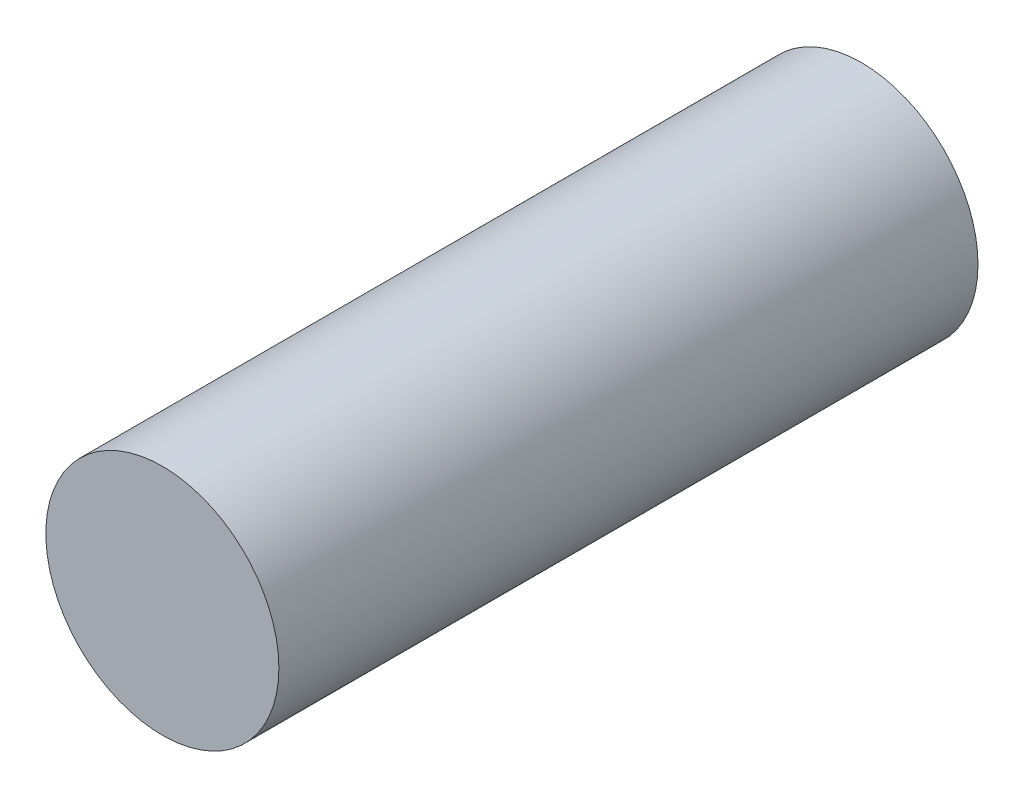
ISO-10303-21;
HEADER;
FILE_DESCRIPTION(('STEP AP214'),'2;1');
FILE_NAME('part.step','',(''),(''),'','','');
FILE_SCHEMA(('AUTOMOTIVE_DESIGN { 1 0 10303 214 1 1 1 1 }'));
ENDSEC;
DATA;
#1=APPLICATION_CONTEXT('core data for automotive mechanical design processes');
#2=APPLICATION_PROTOCOL_DEFINITION('international standard','automotive_design',2000,#1);
#3=PRODUCT_CONTEXT('',#1,'mechanical');
#4=PRODUCT('Part','Part','',(#3));
#5=PRODUCT_RELATED_PRODUCT_CATEGORY('part','',(#4));
#6=PRODUCT_DEFINITION_FORMATION('','',#4);
#7=PRODUCT_DEFINITION_CONTEXT('part definition',#1,'design');
#8=PRODUCT_DEFINITION('design','',#6,#7);
#9=PRODUCT_DEFINITION_SHAPE('','',#8);
#10=(LENGTH_UNIT() NAMED_UNIT(*) SI_UNIT(.MILLI.,.METRE.));
#11=(NAMED_UNIT(*) PLANE_ANGLE_UNIT() SI_UNIT($,.RADIAN.));
#12=(NAMED_UNIT(*) SI_UNIT($,.STERADIAN.) SOLID_ANGLE_UNIT());
#13=UNCERTAINTY_MEASURE_WITH_UNIT(LENGTH_MEASURE(1.E-05),#10,'distance_accuracy_value','');
#14=(GEOMETRIC_REPRESENTATION_CONTEXT(3) GLOBAL_UNCERTAINTY_ASSIGNED_CONTEXT((#13)) GLOBAL_UNIT_ASSIGNED_CONTEXT((#10,
#11,#12)) REPRESENTATION_CONTEXT('',''));
#15=CARTESIAN_POINT('',(0.,0.,0.));
#16=DIRECTION('',(0.,0.,1.));
#17=DIRECTION('',(1.,0.,0.));
#18=AXIS2_PLACEMENT_3D('',#15,#16,#17);
#19=CARTESIAN_POINT('',(-120.238104213596,50.1850711924744,-90.0000000000001));
#20=DIRECTION('',(0.,0.,-1.));
#21=DIRECTION('',(0.,-1.,0.));
#22=AXIS2_PLACEMENT_3D('',#19,#20,#21);
#23=PLANE('',#22);
#24=CARTESIAN_POINT('',(-120.238104213596,50.1850711924743,-90.0000000000001));
#25=DIRECTION('',(0.,0.,-1.));
#26=DIRECTION('',(0.,1.,0.));
#27=AXIS2_PLACEMENT_3D('',#24,#25,#26);
#28=CIRCLE('',#27,15.);
#29=CARTESIAN_POINT('',(-120.238104213596,65.1850711924743,-90.0000000000001));
#30=VERTEX_POINT('',#29);
#31=EDGE_CURVE('E10',#30,#30,#28,.F.);
#32=ORIENTED_EDGE('',*,*,#31,.F.);
#33=EDGE_LOOP('',(#32));
#34=FACE_BOUND('',#33,.T.);
#35=ADVANCED_FACE('F37',(#34),#23,.T.);
#36=CARTESIAN_POINT('',(-120.238104213596,50.1850711924743,0.));
#37=DIRECTION('',(0.,0.,1.));
#38=DIRECTION('',(1.,0.,0.));
#39=AXIS2_PLACEMENT_3D('',#36,#37,#38);
#40=PLANE('',#39);
#41=CARTESIAN_POINT('',(-120.238104213596,50.1850711924743,0.));
#42=DIRECTION('',(0.,0.,1.));
#43=DIRECTION('',(1.,0.,0.));
#44=AXIS2_PLACEMENT_3D('',#41,#42,#43);
#45=CIRCLE('',#44,15.);
#46=CARTESIAN_POINT('',(-105.238104213596,50.1850711924743,0.));
#47=VERTEX_POINT('',#46);
#48=EDGE_CURVE('E43',#47,#47,#45,.T.);
#49=ORIENTED_EDGE('',*,*,#48,.T.);
#50=EDGE_LOOP('',(#49));
#51=FACE_BOUND('',#50,.T.);
#52=ADVANCED_FACE('F49',(#51),#40,.T.);
#53=CARTESIAN_POINT('',(-120.238104213596,50.1850711924743,-132.426406871193));
#54=DIRECTION('',(0.,0.,1.));
#55=DIRECTION('',(1.,0.,0.));
#56=AXIS2_PLACEMENT_3D('',#53,#54,#55);
#57=CYLINDRICAL_SURFACE('',#56,15.);
#58=ORIENTED_EDGE('',*,*,#48,.F.);
#59=EDGE_LOOP('',(#58));
#60=FACE_BOUND('',#59,.T.);
#61=ORIENTED_EDGE('',*,*,#31,.T.);
#62=EDGE_LOOP('',(#61));
#63=FACE_BOUND('',#62,.T.);
#64=ADVANCED_FACE('F51',(#60,#63),#57,.T.);
#65=CLOSED_SHELL('',(#35,#52,#64));
#66=MANIFOLD_SOLID_BREP('B2',#65);
#67=ADVANCED_BREP_SHAPE_REPRESENTATION('',(#18,#66),#14);
#68=SHAPE_DEFINITION_REPRESENTATION(#9,#67);
ENDSEC;
END-ISO-10303-21;
